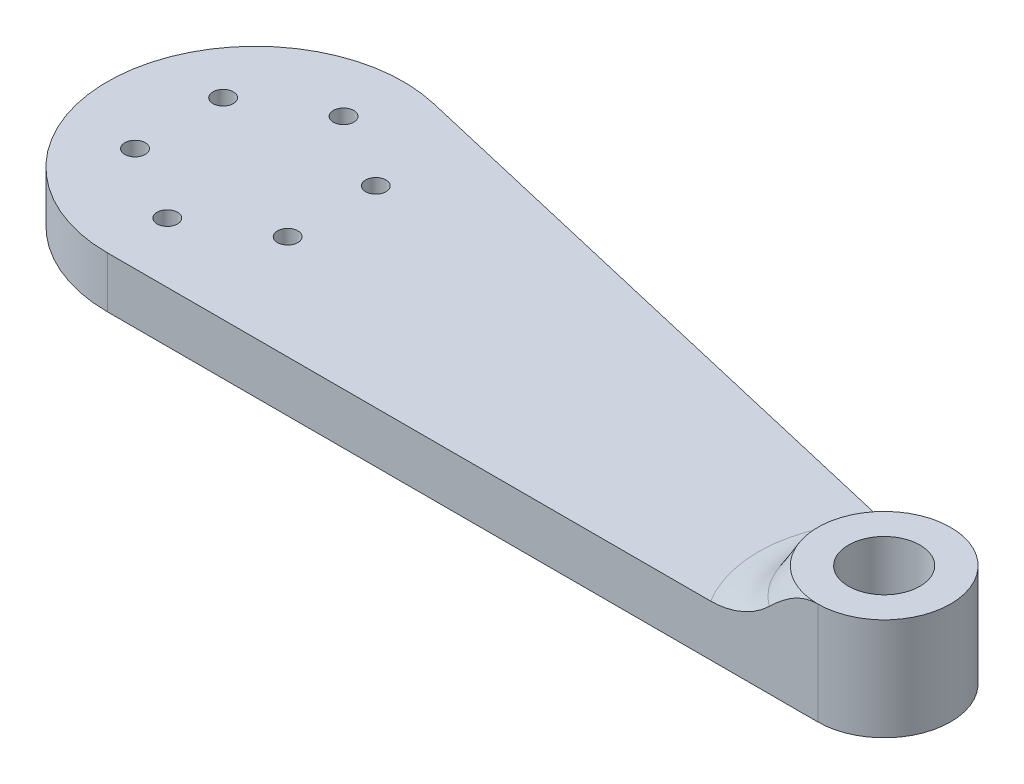
ISO-10303-21;
HEADER;
FILE_DESCRIPTION(('STEP AP214'),'2;1');
FILE_NAME('part.step','',(''),(''),'','','');
FILE_SCHEMA(('AUTOMOTIVE_DESIGN { 1 0 10303 214 1 1 1 1 }'));
ENDSEC;
DATA;
#1=APPLICATION_CONTEXT('core data for automotive mechanical design processes');
#2=APPLICATION_PROTOCOL_DEFINITION('international standard','automotive_design',2000,#1);
#3=PRODUCT_CONTEXT('',#1,'mechanical');
#4=PRODUCT('Part','Part','',(#3));
#5=PRODUCT_RELATED_PRODUCT_CATEGORY('part','',(#4));
#6=PRODUCT_DEFINITION_FORMATION('','',#4);
#7=PRODUCT_DEFINITION_CONTEXT('part definition',#1,'design');
#8=PRODUCT_DEFINITION('design','',#6,#7);
#9=PRODUCT_DEFINITION_SHAPE('','',#8);
#10=(LENGTH_UNIT() NAMED_UNIT(*) SI_UNIT(.MILLI.,.METRE.));
#11=(NAMED_UNIT(*) PLANE_ANGLE_UNIT() SI_UNIT($,.RADIAN.));
#12=(NAMED_UNIT(*) SI_UNIT($,.STERADIAN.) SOLID_ANGLE_UNIT());
#13=UNCERTAINTY_MEASURE_WITH_UNIT(LENGTH_MEASURE(1.E-05),#10,'distance_accuracy_value','');
#14=(GEOMETRIC_REPRESENTATION_CONTEXT(3) GLOBAL_UNCERTAINTY_ASSIGNED_CONTEXT((#13)) GLOBAL_UNIT_ASSIGNED_CONTEXT((#10,
#11,#12)) REPRESENTATION_CONTEXT('',''));
#15=CARTESIAN_POINT('',(0.,0.,0.));
#16=DIRECTION('',(0.,0.,1.));
#17=DIRECTION('',(1.,0.,0.));
#18=AXIS2_PLACEMENT_3D('',#15,#16,#17);
#19=CARTESIAN_POINT('',(139.08270920571,20.,16.));
#20=DIRECTION('',(0.,-1.,0.));
#21=DIRECTION('',(0.,0.,-1.));
#22=AXIS2_PLACEMENT_3D('',#19,#20,#21);
#23=CYLINDRICAL_SURFACE('',#22,13.);
#24=CARTESIAN_POINT('',(139.08270920571,20.,16.));
#25=DIRECTION('',(0.,1.,0.));
#26=DIRECTION('',(0.,0.,1.));
#27=AXIS2_PLACEMENT_3D('',#24,#25,#26);
#28=CIRCLE('',#27,13.);
#29=CARTESIAN_POINT('',(139.08270920571,20.,29.));
#30=VERTEX_POINT('',#29);
#31=CARTESIAN_POINT('',(142.034668748035,20.,3.33959183673469));
#32=VERTEX_POINT('',#31);
#33=EDGE_CURVE('E184',#30,#32,#28,.T.);
#34=ORIENTED_EDGE('',*,*,#33,.F.);
#35=DIRECTION('',(0.,-1.,0.));
#36=VECTOR('',#35,1.);
#37=CARTESIAN_POINT('',(139.08270920571,10.,29.));
#38=LINE('',#37,#36);
#39=CARTESIAN_POINT('',(139.08270920571,0.,29.));
#40=VERTEX_POINT('',#39);
#41=EDGE_CURVE('E132',#30,#40,#38,.T.);
#42=ORIENTED_EDGE('',*,*,#41,.T.);
#43=CARTESIAN_POINT('',(139.08270920571,0.,16.));
#44=DIRECTION('',(0.,1.,0.));
#45=DIRECTION('',(0.,0.,1.));
#46=AXIS2_PLACEMENT_3D('',#43,#44,#45);
#47=CIRCLE('',#46,13.);
#48=CARTESIAN_POINT('',(142.034668748035,0.,3.33959183673468));
#49=VERTEX_POINT('',#48);
#50=EDGE_CURVE('E183',#40,#49,#47,.T.);
#51=ORIENTED_EDGE('',*,*,#50,.T.);
#52=DIRECTION('',(0.,-1.,0.));
#53=VECTOR('',#52,1.);
#54=CARTESIAN_POINT('',(142.034668748035,10.,3.33959183673469));
#55=LINE('',#54,#53);
#56=EDGE_CURVE('E112',#32,#49,#55,.T.);
#57=ORIENTED_EDGE('',*,*,#56,.F.);
#58=EDGE_LOOP('',(#34,#42,#51,#57));
#59=FACE_BOUND('',#58,.T.);
#60=ADVANCED_FACE('F43',(#59),#23,.T.);
#61=CARTESIAN_POINT('',(139.08270920571,20.,16.));
#62=DIRECTION('',(0.,-1.,0.));
#63=DIRECTION('',(0.,0.,-1.));
#64=AXIS2_PLACEMENT_3D('',#61,#62,#63);
#65=CYLINDRICAL_SURFACE('',#64,7.00000000000001);
#66=CARTESIAN_POINT('',(139.08270920571,20.,16.));
#67=DIRECTION('',(0.,1.,0.));
#68=DIRECTION('',(0.,0.,1.));
#69=AXIS2_PLACEMENT_3D('',#66,#67,#68);
#70=CIRCLE('',#69,7.00000000000001);
#71=CARTESIAN_POINT('',(139.08270920571,20.,23.));
#72=VERTEX_POINT('',#71);
#73=EDGE_CURVE('E178',#72,#72,#70,.T.);
#74=ORIENTED_EDGE('',*,*,#73,.T.);
#75=EDGE_LOOP('',(#74));
#76=FACE_BOUND('',#75,.T.);
#77=CARTESIAN_POINT('',(139.08270920571,0.,16.));
#78=DIRECTION('',(0.,1.,0.));
#79=DIRECTION('',(0.,0.,1.));
#80=AXIS2_PLACEMENT_3D('',#77,#78,#79);
#81=CIRCLE('',#80,7.00000000000001);
#82=CARTESIAN_POINT('',(139.08270920571,0.,23.));
#83=VERTEX_POINT('',#82);
#84=EDGE_CURVE('E177',#83,#83,#81,.T.);
#85=ORIENTED_EDGE('',*,*,#84,.F.);
#86=EDGE_LOOP('',(#85));
#87=FACE_BOUND('',#86,.T.);
#88=ADVANCED_FACE('F218',(#76,#87),#65,.F.);
#89=CARTESIAN_POINT('',(0.,20.,0.));
#90=DIRECTION('',(0.,1.,0.));
#91=DIRECTION('',(0.,0.,1.));
#92=AXIS2_PLACEMENT_3D('',#89,#90,#91);
#93=PLANE('',#92);
#94=ORIENTED_EDGE('',*,*,#73,.F.);
#95=EDGE_LOOP('',(#94));
#96=FACE_BOUND('',#95,.T.);
#97=ORIENTED_EDGE('',*,*,#33,.T.);
#98=EDGE_CURVE('E182',#32,#30,#28,.T.);
#99=ORIENTED_EDGE('',*,*,#98,.T.);
#100=EDGE_LOOP('',(#97,#99));
#101=FACE_BOUND('',#100,.T.);
#102=ADVANCED_FACE('F222',(#96,#101),#93,.T.);
#103=CARTESIAN_POINT('',(0.,0.,0.));
#104=DIRECTION('',(0.,1.,0.));
#105=DIRECTION('',(0.,0.,1.));
#106=AXIS2_PLACEMENT_3D('',#103,#104,#105);
#107=PLANE('',#106);
#108=ORIENTED_EDGE('',*,*,#84,.T.);
#109=EDGE_LOOP('',(#108));
#110=FACE_BOUND('',#109,.T.);
#111=ORIENTED_EDGE('',*,*,#50,.F.);
#112=DIRECTION('',(1.,0.,0.));
#113=VECTOR('',#112,1.);
#114=CARTESIAN_POINT('',(0.,0.,29.));
#115=LINE('',#114,#113);
#116=CARTESIAN_POINT('',(0.,0.,29.));
#117=VERTEX_POINT('',#116);
#118=EDGE_CURVE('E165',#117,#40,#115,.T.);
#119=ORIENTED_EDGE('',*,*,#118,.F.);
#120=CARTESIAN_POINT('',(0.,0.,0.));
#121=DIRECTION('',(0.,1.,0.));
#122=DIRECTION('',(0.,0.,1.));
#123=AXIS2_PLACEMENT_3D('',#120,#121,#122);
#124=CIRCLE('',#123,29.);
#125=CARTESIAN_POINT('',(6.58514051749483,0.,-28.2424489795919));
#126=VERTEX_POINT('',#125);
#127=EDGE_CURVE('E162',#117,#126,#124,.F.);
#128=ORIENTED_EDGE('',*,*,#127,.T.);
#129=DIRECTION('',(0.973877551020408,0.,0.227073810948097));
#130=VECTOR('',#129,1.);
#131=CARTESIAN_POINT('',(6.58514051749483,0.,-28.2424489795919));
#132=LINE('',#131,#130);
#133=EDGE_CURVE('E106',#126,#49,#132,.T.);
#134=ORIENTED_EDGE('',*,*,#133,.T.);
#135=EDGE_LOOP('',(#111,#119,#128,#134));
#136=FACE_BOUND('',#135,.T.);
#137=CARTESIAN_POINT('',(14.9389382152816,0.,8.62499999999999));
#138=DIRECTION('',(0.,1.,0.));
#139=DIRECTION('',(0.,0.,1.));
#140=AXIS2_PLACEMENT_3D('',#137,#138,#139);
#141=CIRCLE('',#140,2.);
#142=CARTESIAN_POINT('',(14.9389382152816,0.,10.625));
#143=VERTEX_POINT('',#142);
#144=EDGE_CURVE('E136',#143,#143,#141,.T.);
#145=ORIENTED_EDGE('',*,*,#144,.T.);
#146=EDGE_LOOP('',(#145));
#147=FACE_BOUND('',#146,.T.);
#148=CARTESIAN_POINT('',(14.9389382152816,0.,-8.62500000000001));
#149=DIRECTION('',(0.,1.,0.));
#150=DIRECTION('',(0.,0.,1.));
#151=AXIS2_PLACEMENT_3D('',#148,#149,#150);
#152=CIRCLE('',#151,2.);
#153=CARTESIAN_POINT('',(14.9389382152816,0.,-6.62500000000001));
#154=VERTEX_POINT('',#153);
#155=EDGE_CURVE('E140',#154,#154,#152,.T.);
#156=ORIENTED_EDGE('',*,*,#155,.T.);
#157=EDGE_LOOP('',(#156));
#158=FACE_BOUND('',#157,.T.);
#159=CARTESIAN_POINT('',(0.,0.,-17.25));
#160=DIRECTION('',(0.,1.,0.));
#161=DIRECTION('',(0.,0.,1.));
#162=AXIS2_PLACEMENT_3D('',#159,#160,#161);
#163=CIRCLE('',#162,2.);
#164=CARTESIAN_POINT('',(0.,0.,-15.25));
#165=VERTEX_POINT('',#164);
#166=EDGE_CURVE('E144',#165,#165,#163,.T.);
#167=ORIENTED_EDGE('',*,*,#166,.T.);
#168=EDGE_LOOP('',(#167));
#169=FACE_BOUND('',#168,.T.);
#170=CARTESIAN_POINT('',(-14.9389382152816,0.,-8.625));
#171=DIRECTION('',(0.,1.,0.));
#172=DIRECTION('',(0.,0.,1.));
#173=AXIS2_PLACEMENT_3D('',#170,#171,#172);
#174=CIRCLE('',#173,2.00000000000001);
#175=CARTESIAN_POINT('',(-14.9389382152816,0.,-6.62499999999999));
#176=VERTEX_POINT('',#175);
#177=EDGE_CURVE('E148',#176,#176,#174,.T.);
#178=ORIENTED_EDGE('',*,*,#177,.T.);
#179=EDGE_LOOP('',(#178));
#180=FACE_BOUND('',#179,.T.);
#181=CARTESIAN_POINT('',(-14.9389382152816,0.,8.625));
#182=DIRECTION('',(0.,1.,0.));
#183=DIRECTION('',(0.,0.,1.));
#184=AXIS2_PLACEMENT_3D('',#181,#182,#183);
#185=CIRCLE('',#184,2.);
#186=CARTESIAN_POINT('',(-14.9389382152816,0.,10.625));
#187=VERTEX_POINT('',#186);
#188=EDGE_CURVE('E152',#187,#187,#185,.T.);
#189=ORIENTED_EDGE('',*,*,#188,.T.);
#190=EDGE_LOOP('',(#189));
#191=FACE_BOUND('',#190,.T.);
#192=CARTESIAN_POINT('',(0.,0.,17.25));
#193=DIRECTION('',(0.,1.,0.));
#194=DIRECTION('',(0.,0.,1.));
#195=AXIS2_PLACEMENT_3D('',#192,#193,#194);
#196=CIRCLE('',#195,2.);
#197=CARTESIAN_POINT('',(0.,0.,19.25));
#198=VERTEX_POINT('',#197);
#199=EDGE_CURVE('E156',#198,#198,#196,.T.);
#200=ORIENTED_EDGE('',*,*,#199,.T.);
#201=EDGE_LOOP('',(#200));
#202=FACE_BOUND('',#201,.T.);
#203=ADVANCED_FACE('F227',(#110,#136,#147,#158,#169,#180,#191,#202),#107,.F.);
#204=CARTESIAN_POINT('',(6.58514051749483,10.,-28.2424489795919));
#205=DIRECTION('',(0.227073810948097,0.,-0.973877551020408));
#206=DIRECTION('',(-0.973877551020408,0.,-0.227073810948097));
#207=AXIS2_PLACEMENT_3D('',#204,#205,#206);
#208=PLANE('',#207);
#209=ORIENTED_EDGE('',*,*,#133,.F.);
#210=DIRECTION('',(0.,-1.,0.));
#211=VECTOR('',#210,1.);
#212=CARTESIAN_POINT('',(6.58514051749483,10.,-28.2424489795919));
#213=LINE('',#212,#211);
#214=CARTESIAN_POINT('',(6.58514051749483,10.,-28.2424489795919));
#215=VERTEX_POINT('',#214);
#216=EDGE_CURVE('E100',#215,#126,#213,.T.);
#217=ORIENTED_EDGE('',*,*,#216,.F.);
#218=DIRECTION('',(0.973877551020408,0.,0.227073810948097));
#219=VECTOR('',#218,1.);
#220=CARTESIAN_POINT('',(6.58514051749483,10.,-28.2424489795919));
#221=LINE('',#220,#219);
#222=CARTESIAN_POINT('',(121.619722828883,10.,-1.42045172860258));
#223=VERTEX_POINT('',#222);
#224=EDGE_CURVE('E103',#215,#223,#221,.T.);
#225=ORIENTED_EDGE('',*,*,#224,.T.);
#226=CARTESIAN_POINT('',(121.619722828883,10.,-1.42045172860259));
#227=CARTESIAN_POINT('',(122.034349824591,9.99997466087024,-1.32377537340908));
#228=CARTESIAN_POINT('',(122.448790600288,10.0196314271799,-1.22714243813791));
#229=CARTESIAN_POINT('',(123.274047313159,10.0960467399934,-1.03472175177363));
#230=CARTESIAN_POINT('',(123.684866311898,10.152770126726,-0.938933286831914));
#231=CARTESIAN_POINT('',(124.499544609194,10.3009048789056,-0.748979112952442));
#232=CARTESIAN_POINT('',(124.903416997865,10.3922412295988,-0.654810351863337));
#233=CARTESIAN_POINT('',(125.702940029582,10.6073737613431,-0.468389850063439));
#234=CARTESIAN_POINT('',(126.098588744026,10.7311774659269,-0.376138559034915));
#235=CARTESIAN_POINT('',(126.882276932433,11.0100055345759,-0.193410182813167));
#236=CARTESIAN_POINT('',(127.270246735678,11.1652356393366,-0.102949342368435));
#237=CARTESIAN_POINT('',(128.034103210279,11.5043668407572,0.0751549793948264));
#238=CARTESIAN_POINT('',(128.409989501957,11.6882688372597,0.162798372186041));
#239=CARTESIAN_POINT('',(129.148075005639,12.0830152141646,0.334893814730137));
#240=CARTESIAN_POINT('',(129.51027396323,12.2938600950471,0.419345805163057));
#241=CARTESIAN_POINT('',(130.219270451808,12.7411738128914,0.584658717901873));
#242=CARTESIAN_POINT('',(130.566071887658,12.9776361002563,0.665520550683779));
#243=CARTESIAN_POINT('',(131.071286849771,13.3496647827576,0.783318816672121));
#244=CARTESIAN_POINT('',(131.236332519078,13.4758280846617,0.821801631139584));
#245=CARTESIAN_POINT('',(131.561790819168,13.7342474060691,0.897686999303919));
#246=CARTESIAN_POINT('',(131.722204504291,13.8665020209869,0.935089798835299));
#247=CARTESIAN_POINT('',(132.03769692357,14.1368818058686,1.00865147596402));
#248=CARTESIAN_POINT('',(132.192786274921,14.2749938970682,1.04481282911542));
#249=CARTESIAN_POINT('',(132.497496074969,14.5575392774129,1.1158603806867));
#250=CARTESIAN_POINT('',(132.647114637688,14.7019747094325,1.15074613936302));
#251=CARTESIAN_POINT('',(132.793699099352,14.849619250896,1.18492445295172));
#252=B_SPLINE_CURVE_WITH_KNOTS('',3,(#226,#227,#228,#229,#230,#231,#232,#233,#234,#235,#236,
#237,#238,#239,#240,#241,#242,#243,#244,#245,#246,#247,#248,#249,#250,#251),.UNSPECIFIED.,.F.,
.F.,(4,2,2,2,2,2,2,2,2,2,2,2,4),(0.,1.2765149077705,2.55182072367089,3.82437830171762,
5.09723102550494,6.37870316436266,7.660215529211,8.94175170237371,10.2229609952719,
10.8566794517282,11.4902525046521,12.1224785625552,12.7549205553281),.UNSPECIFIED.);
#253=CARTESIAN_POINT('',(132.793699099353,14.8496192508964,1.18492445295181));
#254=VERTEX_POINT('',#253);
#255=EDGE_CURVE('E58',#223,#254,#252,.T.);
#256=ORIENTED_EDGE('',*,*,#255,.T.);
#257=CARTESIAN_POINT('',(128.528735247532,10.,0.190485681492357));
#258=CARTESIAN_POINT('',(128.683205214915,10.1925868564306,0.226502616202267));
#259=CARTESIAN_POINT('',(128.838409330936,10.3845525605203,0.262690728417097));
#260=CARTESIAN_POINT('',(129.1504188833,10.767113544626,0.335440324126827));
#261=CARTESIAN_POINT('',(129.30722435369,10.9577087953571,0.372001815560202));
#262=CARTESIAN_POINT('',(129.780353415219,11.5273800863477,0.482318784011858));
#263=CARTESIAN_POINT('',(130.099271316974,11.9041936720154,0.556679162537081));
#264=CARTESIAN_POINT('',(130.750932369888,12.6569570548134,0.708623478921217));
#265=CARTESIAN_POINT('',(131.083819965811,13.0327754228304,0.786241096191958));
#266=CARTESIAN_POINT('',(131.759616314173,13.7746911287697,0.943812910108963));
#267=CARTESIAN_POINT('',(132.10252336668,14.1407900958288,1.02376671039124));
#268=CARTESIAN_POINT('',(132.835047533447,14.8963387335376,1.19456544580228));
#269=CARTESIAN_POINT('',(133.225927575404,15.2845107440451,1.28570485101563));
#270=CARTESIAN_POINT('',(133.825931530303,15.851781746928,1.42560455861236));
#271=CARTESIAN_POINT('',(134.028288320375,16.0384383192963,1.4727870072117));
#272=CARTESIAN_POINT('',(134.438051222692,16.4058014997402,1.5683292278089));
#273=CARTESIAN_POINT('',(134.645456941708,16.5865085686223,1.6166889081197));
#274=CARTESIAN_POINT('',(135.064284405902,16.9395553692518,1.71434466404577));
#275=CARTESIAN_POINT('',(135.275663349759,17.1119484895582,1.76363075990612));
#276=CARTESIAN_POINT('',(135.704579702632,17.448539385257,1.86363888795336));
#277=CARTESIAN_POINT('',(135.922117711025,17.6127363587038,1.91436105989402));
#278=CARTESIAN_POINT('',(136.363659157067,17.9310942660855,2.01731291327548));
#279=CARTESIAN_POINT('',(136.587653966673,18.0852677714854,2.06954058296217));
#280=CARTESIAN_POINT('',(137.042907563362,18.3817910649893,2.17568962504615));
#281=CARTESIAN_POINT('',(137.274163914746,18.5241447605744,2.22961042952477));
#282=CARTESIAN_POINT('',(137.624619427865,18.7257245856447,2.31132426392657));
#283=CARTESIAN_POINT('',(137.740884107309,18.7903527200723,2.33843307633568));
#284=CARTESIAN_POINT('',(137.975314524567,18.915862527064,2.39309396074888));
#285=CARTESIAN_POINT('',(138.093480272758,18.9767441791691,2.42064603517252));
#286=CARTESIAN_POINT('',(138.451000089061,19.1533191293596,2.50400701530023));
#287=CARTESIAN_POINT('',(138.693279544629,19.2628859176904,2.56049801792434));
#288=CARTESIAN_POINT('',(139.181491104597,19.4610310176146,2.67433169173129));
#289=CARTESIAN_POINT('',(139.427306323354,19.5499115599012,2.73164710931506));
#290=CARTESIAN_POINT('',(139.92540436848,19.7057713120733,2.84778596189879));
#291=CARTESIAN_POINT('',(140.177683299102,19.7727633943878,2.90660848854835));
#292=CARTESIAN_POINT('',(140.563378921163,19.8555277165348,2.99653907035043));
#293=CARTESIAN_POINT('',(140.69499205955,19.880371370975,3.02722660070083));
#294=CARTESIAN_POINT('',(140.959250531792,19.9232481869643,3.0888423328885));
#295=CARTESIAN_POINT('',(141.091895642271,19.9412827826839,3.11977048264265));
#296=CARTESIAN_POINT('',(141.359338479772,19.9704531884144,3.18212869621718));
#297=CARTESIAN_POINT('',(141.494144062124,19.981513211099,3.21356059162315));
#298=CARTESIAN_POINT('',(141.764187042707,19.9962970914206,3.27652506662985));
#299=CARTESIAN_POINT('',(141.899424586575,20.0000181370923,3.30805768018808));
#300=CARTESIAN_POINT('',(142.034668748035,19.9999999999999,3.33959183673468));
#301=B_SPLINE_CURVE_WITH_KNOTS('',3,(#257,#258,#259,#260,#261,#262,#263,#264,#265,#266,#267,
#268,#269,#270,#271,#272,#273,#274,#275,#276,#277,#278,#279,#280,#281,#282,#283,#284,#285,#286,
#287,#288,#289,#290,#291,#292,#293,#294,#295,#296,#297,#298,#299,#300),.UNSPECIFIED.,.F.,.F.,(4,
2,2,2,2,2,2,2,2,2,2,2,2,2,2,2,2,2,2,2,2,4),(0.,0.748482537380163,1.49698102163445,
2.99455237125864,4.51842841976148,6.04204740709455,7.7165432348728,8.55439067317975,
9.39217306436218,10.2235533181393,11.0550147588512,11.8854124170564,12.715534454038,
13.1227380193508,13.5299438081535,14.3446987824012,15.1466751617553,15.948179052708,
16.3602578436734,16.7722497912955,17.1886447102555,17.6051991420217),.UNSPECIFIED.);
#302=EDGE_CURVE('E200',#254,#32,#301,.T.);
#303=ORIENTED_EDGE('',*,*,#302,.T.);
#304=ORIENTED_EDGE('',*,*,#56,.T.);
#305=EDGE_LOOP('',(#209,#217,#225,#256,#303,#304));
#306=FACE_BOUND('',#305,.T.);
#307=ADVANCED_FACE('F102',(#306),#208,.T.);
#308=CARTESIAN_POINT('',(0.,10.,0.));
#309=DIRECTION('',(0.,-1.,0.));
#310=DIRECTION('',(0.,0.,-1.));
#311=AXIS2_PLACEMENT_3D('',#308,#309,#310);
#312=CYLINDRICAL_SURFACE('',#311,29.);
#313=ORIENTED_EDGE('',*,*,#127,.F.);
#314=DIRECTION('',(0.,-1.,0.));
#315=VECTOR('',#314,1.);
#316=CARTESIAN_POINT('',(0.,10.,29.));
#317=LINE('',#316,#315);
#318=CARTESIAN_POINT('',(0.,10.,29.));
#319=VERTEX_POINT('',#318);
#320=EDGE_CURVE('E113',#319,#117,#317,.T.);
#321=ORIENTED_EDGE('',*,*,#320,.F.);
#322=CARTESIAN_POINT('',(0.,10.,0.));
#323=DIRECTION('',(0.,1.,0.));
#324=DIRECTION('',(0.,0.,1.));
#325=AXIS2_PLACEMENT_3D('',#322,#323,#324);
#326=CIRCLE('',#325,29.);
#327=EDGE_CURVE('E120',#319,#215,#326,.F.);
#328=ORIENTED_EDGE('',*,*,#327,.T.);
#329=ORIENTED_EDGE('',*,*,#216,.T.);
#330=EDGE_LOOP('',(#313,#321,#328,#329));
#331=FACE_BOUND('',#330,.T.);
#332=ADVANCED_FACE('F126',(#331),#312,.T.);
#333=CARTESIAN_POINT('',(0.,10.,17.25));
#334=DIRECTION('',(0.,-1.,0.));
#335=DIRECTION('',(0.,0.,-1.));
#336=AXIS2_PLACEMENT_3D('',#333,#334,#335);
#337=CYLINDRICAL_SURFACE('',#336,2.);
#338=CARTESIAN_POINT('',(0.,10.,17.25));
#339=DIRECTION('',(0.,1.,0.));
#340=DIRECTION('',(0.,0.,1.));
#341=AXIS2_PLACEMENT_3D('',#338,#339,#340);
#342=CIRCLE('',#341,2.);
#343=CARTESIAN_POINT('',(0.,10.,19.25));
#344=VERTEX_POINT('',#343);
#345=EDGE_CURVE('E124',#344,#344,#342,.T.);
#346=ORIENTED_EDGE('',*,*,#345,.T.);
#347=EDGE_LOOP('',(#346));
#348=FACE_BOUND('',#347,.T.);
#349=ORIENTED_EDGE('',*,*,#199,.F.);
#350=EDGE_LOOP('',(#349));
#351=FACE_BOUND('',#350,.T.);
#352=ADVANCED_FACE('F253',(#348,#351),#337,.F.);
#353=CARTESIAN_POINT('',(-14.9389382152816,10.,8.625));
#354=DIRECTION('',(0.,-1.,0.));
#355=DIRECTION('',(0.,0.,-1.));
#356=AXIS2_PLACEMENT_3D('',#353,#354,#355);
#357=CYLINDRICAL_SURFACE('',#356,2.);
#358=CARTESIAN_POINT('',(-14.9389382152816,10.,8.625));
#359=DIRECTION('',(0.,1.,0.));
#360=DIRECTION('',(0.,0.,1.));
#361=AXIS2_PLACEMENT_3D('',#358,#359,#360);
#362=CIRCLE('',#361,2.);
#363=CARTESIAN_POINT('',(-14.9389382152816,10.,10.625));
#364=VERTEX_POINT('',#363);
#365=EDGE_CURVE('E406',#364,#364,#362,.T.);
#366=ORIENTED_EDGE('',*,*,#365,.T.);
#367=EDGE_LOOP('',(#366));
#368=FACE_BOUND('',#367,.T.);
#369=ORIENTED_EDGE('',*,*,#188,.F.);
#370=EDGE_LOOP('',(#369));
#371=FACE_BOUND('',#370,.T.);
#372=ADVANCED_FACE('F249',(#368,#371),#357,.F.);
#373=CARTESIAN_POINT('',(-14.9389382152816,10.,-8.625));
#374=DIRECTION('',(0.,-1.,0.));
#375=DIRECTION('',(0.,0.,-1.));
#376=AXIS2_PLACEMENT_3D('',#373,#374,#375);
#377=CYLINDRICAL_SURFACE('',#376,2.00000000000001);
#378=CARTESIAN_POINT('',(-14.9389382152816,10.,-8.625));
#379=DIRECTION('',(0.,1.,0.));
#380=DIRECTION('',(0.,0.,1.));
#381=AXIS2_PLACEMENT_3D('',#378,#379,#380);
#382=CIRCLE('',#381,2.00000000000001);
#383=CARTESIAN_POINT('',(-14.9389382152816,10.,-6.62499999999999));
#384=VERTEX_POINT('',#383);
#385=EDGE_CURVE('E402',#384,#384,#382,.T.);
#386=ORIENTED_EDGE('',*,*,#385,.T.);
#387=EDGE_LOOP('',(#386));
#388=FACE_BOUND('',#387,.T.);
#389=ORIENTED_EDGE('',*,*,#177,.F.);
#390=EDGE_LOOP('',(#389));
#391=FACE_BOUND('',#390,.T.);
#392=ADVANCED_FACE('F245',(#388,#391),#377,.F.);
#393=CARTESIAN_POINT('',(0.,10.,-17.25));
#394=DIRECTION('',(0.,-1.,0.));
#395=DIRECTION('',(0.,0.,-1.));
#396=AXIS2_PLACEMENT_3D('',#393,#394,#395);
#397=CYLINDRICAL_SURFACE('',#396,2.);
#398=CARTESIAN_POINT('',(0.,10.,-17.25));
#399=DIRECTION('',(0.,1.,0.));
#400=DIRECTION('',(0.,0.,1.));
#401=AXIS2_PLACEMENT_3D('',#398,#399,#400);
#402=CIRCLE('',#401,2.);
#403=CARTESIAN_POINT('',(0.,10.,-15.25));
#404=VERTEX_POINT('',#403);
#405=EDGE_CURVE('E398',#404,#404,#402,.T.);
#406=ORIENTED_EDGE('',*,*,#405,.T.);
#407=EDGE_LOOP('',(#406));
#408=FACE_BOUND('',#407,.T.);
#409=ORIENTED_EDGE('',*,*,#166,.F.);
#410=EDGE_LOOP('',(#409));
#411=FACE_BOUND('',#410,.T.);
#412=ADVANCED_FACE('F241',(#408,#411),#397,.F.);
#413=CARTESIAN_POINT('',(14.9389382152816,10.,-8.62500000000001));
#414=DIRECTION('',(0.,-1.,0.));
#415=DIRECTION('',(0.,0.,-1.));
#416=AXIS2_PLACEMENT_3D('',#413,#414,#415);
#417=CYLINDRICAL_SURFACE('',#416,2.);
#418=CARTESIAN_POINT('',(14.9389382152816,10.,-8.62500000000001));
#419=DIRECTION('',(0.,1.,0.));
#420=DIRECTION('',(0.,0.,1.));
#421=AXIS2_PLACEMENT_3D('',#418,#419,#420);
#422=CIRCLE('',#421,2.);
#423=CARTESIAN_POINT('',(14.9389382152816,10.,-6.62500000000001));
#424=VERTEX_POINT('',#423);
#425=EDGE_CURVE('E394',#424,#424,#422,.T.);
#426=ORIENTED_EDGE('',*,*,#425,.T.);
#427=EDGE_LOOP('',(#426));
#428=FACE_BOUND('',#427,.T.);
#429=ORIENTED_EDGE('',*,*,#155,.F.);
#430=EDGE_LOOP('',(#429));
#431=FACE_BOUND('',#430,.T.);
#432=ADVANCED_FACE('F237',(#428,#431),#417,.F.);
#433=CARTESIAN_POINT('',(14.9389382152816,10.,8.62499999999999));
#434=DIRECTION('',(0.,-1.,0.));
#435=DIRECTION('',(0.,0.,-1.));
#436=AXIS2_PLACEMENT_3D('',#433,#434,#435);
#437=CYLINDRICAL_SURFACE('',#436,2.);
#438=CARTESIAN_POINT('',(14.9389382152816,10.,8.62499999999999));
#439=DIRECTION('',(0.,1.,0.));
#440=DIRECTION('',(0.,0.,1.));
#441=AXIS2_PLACEMENT_3D('',#438,#439,#440);
#442=CIRCLE('',#441,2.);
#443=CARTESIAN_POINT('',(14.9389382152816,10.,10.625));
#444=VERTEX_POINT('',#443);
#445=EDGE_CURVE('E169',#444,#444,#442,.T.);
#446=ORIENTED_EDGE('',*,*,#445,.T.);
#447=EDGE_LOOP('',(#446));
#448=FACE_BOUND('',#447,.T.);
#449=ORIENTED_EDGE('',*,*,#144,.F.);
#450=EDGE_LOOP('',(#449));
#451=FACE_BOUND('',#450,.T.);
#452=ADVANCED_FACE('F234',(#448,#451),#437,.F.);
#453=CARTESIAN_POINT('',(0.,10.,29.));
#454=DIRECTION('',(0.,0.,-1.));
#455=DIRECTION('',(-1.,0.,0.));
#456=AXIS2_PLACEMENT_3D('',#453,#454,#455);
#457=PLANE('',#456);
#458=ORIENTED_EDGE('',*,*,#118,.T.);
#459=ORIENTED_EDGE('',*,*,#41,.F.);
#460=CARTESIAN_POINT('',(139.08270920571,19.9999999999999,29.));
#461=CARTESIAN_POINT('',(138.949902466022,20.0000098079991,29.));
#462=CARTESIAN_POINT('',(138.81711967375,19.9966113561083,29.));
#463=CARTESIAN_POINT('',(138.55191829304,19.9830948962287,29.));
#464=CARTESIAN_POINT('',(138.419499646987,19.9729780209429,29.));
#465=CARTESIAN_POINT('',(138.023860821854,19.9327608898705,29.));
#466=CARTESIAN_POINT('',(137.761587580467,19.8927931262283,29.));
#467=CARTESIAN_POINT('',(137.247906115923,19.7896042906292,29.));
#468=CARTESIAN_POINT('',(136.996386197244,19.7269264256475,29.));
#469=CARTESIAN_POINT('',(136.499384533079,19.5807158780702,29.));
#470=CARTESIAN_POINT('',(136.253906546943,19.4971705547576,29.));
#471=CARTESIAN_POINT('',(135.662796332427,19.2710148063087,29.));
#472=CARTESIAN_POINT('',(135.320909386146,19.1186264411852,29.));
#473=CARTESIAN_POINT('',(134.652069467066,18.7841229898944,29.));
#474=CARTESIAN_POINT('',(134.325124799293,18.6019916234509,29.));
#475=CARTESIAN_POINT('',(133.678874867774,18.2106994478786,29.));
#476=CARTESIAN_POINT('',(133.359858753987,18.0010656162566,29.));
#477=CARTESIAN_POINT('',(132.735093962476,17.5632255547165,29.));
#478=CARTESIAN_POINT('',(132.429341768577,17.3350242935971,29.));
#479=CARTESIAN_POINT('',(131.793539680268,16.8359545159271,29.));
#480=CARTESIAN_POINT('',(131.464943718793,16.5632439183133,29.));
#481=CARTESIAN_POINT('',(130.819944514322,16.0036992636073,29.));
#482=CARTESIAN_POINT('',(130.50354447681,15.7168615379637,29.));
#483=CARTESIAN_POINT('',(129.880642131137,15.1316564873555,29.));
#484=CARTESIAN_POINT('',(129.574157268649,14.8332706750603,29.));
#485=CARTESIAN_POINT('',(128.970108253955,14.2276933417808,29.));
#486=CARTESIAN_POINT('',(128.672543223868,13.9205026932192,29.));
#487=CARTESIAN_POINT('',(128.103352385181,13.3183643461757,29.));
#488=CARTESIAN_POINT('',(127.831266999713,13.0238497081265,29.));
#489=CARTESIAN_POINT('',(127.292879975384,12.4295669959631,29.));
#490=CARTESIAN_POINT('',(127.026578581435,12.12979870036,29.));
#491=CARTESIAN_POINT('',(126.500123450395,11.5271174557423,29.));
#492=CARTESIAN_POINT('',(126.2399487395,11.2242227877142,29.));
#493=CARTESIAN_POINT('',(125.72404817696,10.6147369350529,29.));
#494=CARTESIAN_POINT('',(125.468321718404,10.3081462645162,29.));
#495=CARTESIAN_POINT('',(125.214504228245,9.99999999999999,29.));
#496=B_SPLINE_CURVE_WITH_KNOTS('',3,(#460,#461,#462,#463,#464,#465,#466,#467,#468,#469,#470,
#471,#472,#473,#474,#475,#476,#477,#478,#479,#480,#481,#482,#483,#484,#485,#486,#487,#488,#489,
#490,#491,#492,#493,#494,#495),.UNSPECIFIED.,.F.,.F.,(4,2,2,2,2,2,2,2,2,2,2,2,2,2,2,2,2,4),(0.,
0.398330672081278,0.796594204018827,1.59112002575859,2.36777618877118,3.14490396658277,
4.26589359841468,5.38749889005544,6.53183732448286,7.67587052532853,8.95641118625107,
10.2372861512589,11.5203041593834,12.8031954768076,14.0059904486354,15.2088362516409,
16.4066757507953,17.604350515697),.UNSPECIFIED.);
#497=CARTESIAN_POINT('',(129.593867781039,14.8496192508994,29.));
#498=VERTEX_POINT('',#497);
#499=EDGE_CURVE('E188',#30,#498,#496,.T.);
#500=ORIENTED_EDGE('',*,*,#499,.T.);
#501=CARTESIAN_POINT('',(129.593867781039,14.8496192508994,29.));
#502=CARTESIAN_POINT('',(129.443347998452,14.7019713299884,29.));
#503=CARTESIAN_POINT('',(129.289712579584,14.5575326289904,29.));
#504=CARTESIAN_POINT('',(128.976794304212,14.2749559638988,29.));
#505=CARTESIAN_POINT('',(128.817512379632,14.1368169686008,29.));
#506=CARTESIAN_POINT('',(128.493908342817,13.8667347172952,29.));
#507=CARTESIAN_POINT('',(128.329588544057,13.734788685792,29.));
#508=CARTESIAN_POINT('',(127.996244963343,13.4769803393847,29.));
#509=CARTESIAN_POINT('',(127.827220930319,13.3511183501753,29.));
#510=CARTESIAN_POINT('',(127.311142155306,12.980886039383,29.));
#511=CARTESIAN_POINT('',(126.957376134429,12.7457773430426,29.));
#512=CARTESIAN_POINT('',(126.234237102409,12.3008512020352,29.));
#513=CARTESIAN_POINT('',(125.864860446013,12.0910397091005,29.));
#514=CARTESIAN_POINT('',(125.058347282892,11.6698699903116,29.));
#515=CARTESIAN_POINT('',(124.619073934175,11.462580142348,29.));
#516=CARTESIAN_POINT('',(123.724695373998,11.0852501521469,29.));
#517=CARTESIAN_POINT('',(123.269587707385,10.9152158165678,29.));
#518=CARTESIAN_POINT('',(122.348078586316,10.6160692310909,29.));
#519=CARTESIAN_POINT('',(121.881729627984,10.4867959094336,29.));
#520=CARTESIAN_POINT('',(120.939346633897,10.2715931725467,29.));
#521=CARTESIAN_POINT('',(120.463319725197,10.1856329833961,29.));
#522=CARTESIAN_POINT('',(119.675357533126,10.0825300672103,29.));
#523=CARTESIAN_POINT('',(119.365159476792,10.0517903427949,29.));
#524=CARTESIAN_POINT('',(118.743396407882,10.0105225486397,29.));
#525=CARTESIAN_POINT('',(118.4318312512,9.99999666355813,29.));
#526=CARTESIAN_POINT('',(118.120170437092,10.,29.));
#527=B_SPLINE_CURVE_WITH_KNOTS('',3,(#501,#502,#503,#504,#505,#506,#507,#508,#509,#510,#511,
#512,#513,#514,#515,#516,#517,#518,#519,#520,#521,#522,#523,#524,#525,#526),.UNSPECIFIED.,.F.,
.F.,(4,2,2,2,2,2,2,2,2,2,2,2,4),(0.,0.63245657658346,1.26480925142604,1.89687576496177,
2.52897607726524,3.80211059981628,5.07554407362896,6.53105948328142,7.98680158899952,
9.43671690064704,10.8856005917067,11.8201433806729,12.7547871668692),.UNSPECIFIED.);
#528=CARTESIAN_POINT('',(118.120170437092,10.,29.));
#529=VERTEX_POINT('',#528);
#530=EDGE_CURVE('E11',#498,#529,#527,.T.);
#531=ORIENTED_EDGE('',*,*,#530,.T.);
#532=DIRECTION('',(1.,0.,0.));
#533=VECTOR('',#532,1.);
#534=CARTESIAN_POINT('',(0.,10.,29.));
#535=LINE('',#534,#533);
#536=EDGE_CURVE('E129',#319,#529,#535,.T.);
#537=ORIENTED_EDGE('',*,*,#536,.F.);
#538=ORIENTED_EDGE('',*,*,#320,.T.);
#539=EDGE_LOOP('',(#458,#459,#500,#531,#537,#538));
#540=FACE_BOUND('',#539,.T.);
#541=ADVANCED_FACE('F207',(#540),#457,.F.);
#542=CARTESIAN_POINT('',(0.,10.,0.));
#543=DIRECTION('',(0.,1.,0.));
#544=DIRECTION('',(0.,0.,1.));
#545=AXIS2_PLACEMENT_3D('',#542,#543,#544);
#546=PLANE('',#545);
#547=ORIENTED_EDGE('',*,*,#445,.F.);
#548=EDGE_LOOP('',(#547));
#549=FACE_BOUND('',#548,.T.);
#550=ORIENTED_EDGE('',*,*,#425,.F.);
#551=EDGE_LOOP('',(#550));
#552=FACE_BOUND('',#551,.T.);
#553=ORIENTED_EDGE('',*,*,#405,.F.);
#554=EDGE_LOOP('',(#553));
#555=FACE_BOUND('',#554,.T.);
#556=ORIENTED_EDGE('',*,*,#385,.F.);
#557=EDGE_LOOP('',(#556));
#558=FACE_BOUND('',#557,.T.);
#559=ORIENTED_EDGE('',*,*,#365,.F.);
#560=EDGE_LOOP('',(#559));
#561=FACE_BOUND('',#560,.T.);
#562=ORIENTED_EDGE('',*,*,#345,.F.);
#563=EDGE_LOOP('',(#562));
#564=FACE_BOUND('',#563,.T.);
#565=ORIENTED_EDGE('',*,*,#536,.T.);
#566=CARTESIAN_POINT('',(139.08270920571,10.,16.));
#567=DIRECTION('',(0.,1.,0.));
#568=DIRECTION('',(0.,0.,1.));
#569=AXIS2_PLACEMENT_3D('',#566,#567,#568);
#570=CIRCLE('',#569,24.6663339721533);
#571=EDGE_CURVE('E122',#529,#223,#570,.F.);
#572=ORIENTED_EDGE('',*,*,#571,.T.);
#573=ORIENTED_EDGE('',*,*,#224,.F.);
#574=ORIENTED_EDGE('',*,*,#327,.F.);
#575=EDGE_LOOP('',(#565,#572,#573,#574));
#576=FACE_BOUND('',#575,.T.);
#577=ADVANCED_FACE('F119',(#549,#552,#555,#558,#561,#564,#576),#546,.T.);
#578=CARTESIAN_POINT('',(139.08270920571,19.9999999999999,16.));
#579=DIRECTION('',(0.,-1.,0.));
#580=DIRECTION('',(0.,0.,-1.));
#581=AXIS2_PLACEMENT_3D('',#578,#579,#580);
#582=CONICAL_SURFACE('',#581,13.,0.541052068118245);
#583=ORIENTED_EDGE('',*,*,#302,.F.);
#584=CARTESIAN_POINT('',(139.08270920571,14.8496192508994,16.));
#585=DIRECTION('',(0.,1.,0.));
#586=DIRECTION('',(0.,0.,1.));
#587=AXIS2_PLACEMENT_3D('',#584,#585,#586);
#588=CIRCLE('',#587,16.0946609651322);
#589=EDGE_CURVE('E65',#254,#498,#588,.T.);
#590=ORIENTED_EDGE('',*,*,#589,.T.);
#591=ORIENTED_EDGE('',*,*,#499,.F.);
#592=ORIENTED_EDGE('',*,*,#98,.F.);
#593=EDGE_LOOP('',(#583,#590,#591,#592));
#594=FACE_BOUND('',#593,.T.);
#595=ADVANCED_FACE('F212',(#594),#582,.T.);
#596=CARTESIAN_POINT('',(139.08270920571,20.,16.));
#597=DIRECTION('',(0.,1.,0.));
#598=DIRECTION('',(0.,0.,1.));
#599=AXIS2_PLACEMENT_3D('',#596,#597,#598);
#600=TOROIDAL_SURFACE('',#599,24.6663339721533,10.);
#601=ORIENTED_EDGE('',*,*,#530,.F.);
#602=ORIENTED_EDGE('',*,*,#589,.F.);
#603=ORIENTED_EDGE('',*,*,#255,.F.);
#604=ORIENTED_EDGE('',*,*,#571,.F.);
#605=EDGE_LOOP('',(#601,#602,#603,#604));
#606=FACE_BOUND('',#605,.T.);
#607=ADVANCED_FACE('F45',(#606),#600,.F.);
#608=CLOSED_SHELL('',(#60,#88,#102,#203,#307,#332,#352,#372,#392,#412,#432,#452,#541,#577,#595,#607));
#609=MANIFOLD_SOLID_BREP('B2',#608);
#610=ADVANCED_BREP_SHAPE_REPRESENTATION('',(#18,#609),#14);
#611=SHAPE_DEFINITION_REPRESENTATION(#9,#610);
ENDSEC;
END-ISO-10303-21;
